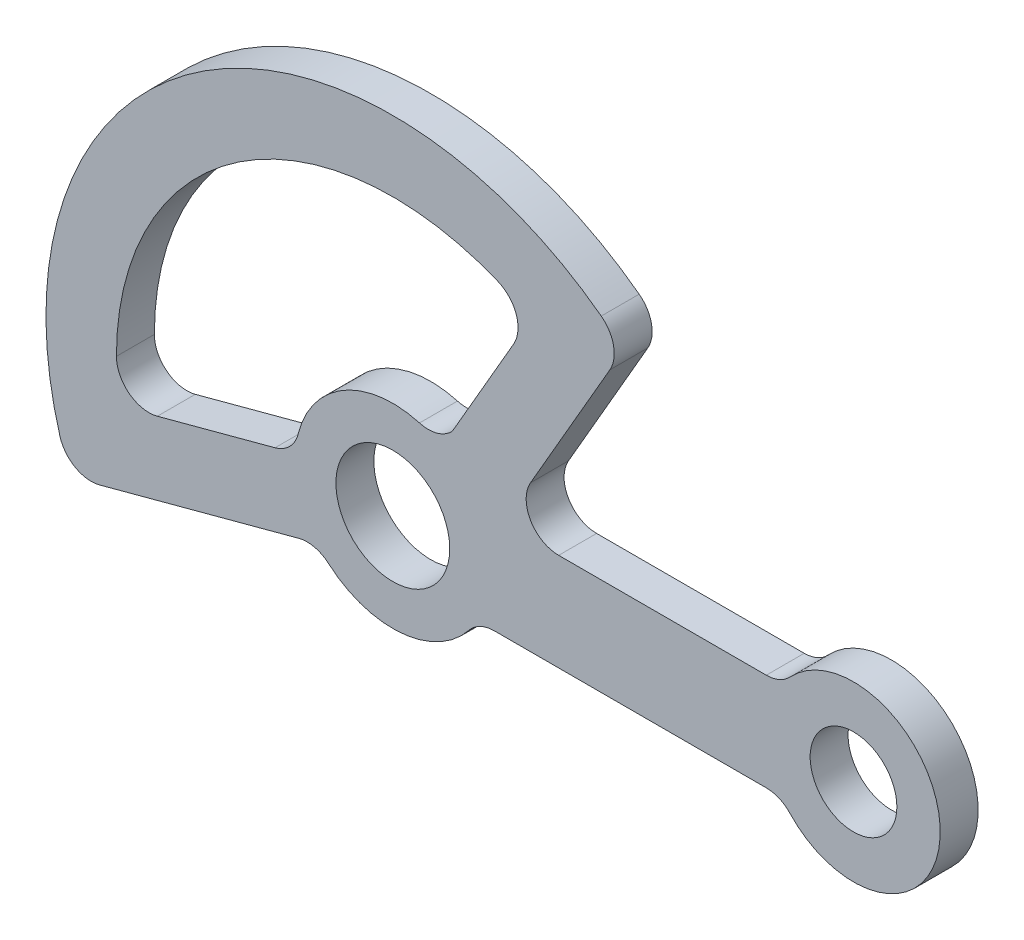
ISO-10303-21;
HEADER;
FILE_DESCRIPTION(('STEP AP214'),'2;1');
FILE_NAME('part.step','',(''),(''),'','','');
FILE_SCHEMA(('AUTOMOTIVE_DESIGN { 1 0 10303 214 1 1 1 1 }'));
ENDSEC;
DATA;
#1=APPLICATION_CONTEXT('core data for automotive mechanical design processes');
#2=APPLICATION_PROTOCOL_DEFINITION('international standard','automotive_design',2000,#1);
#3=PRODUCT_CONTEXT('',#1,'mechanical');
#4=PRODUCT('Part','Part','',(#3));
#5=PRODUCT_RELATED_PRODUCT_CATEGORY('part','',(#4));
#6=PRODUCT_DEFINITION_FORMATION('','',#4);
#7=PRODUCT_DEFINITION_CONTEXT('part definition',#1,'design');
#8=PRODUCT_DEFINITION('design','',#6,#7);
#9=PRODUCT_DEFINITION_SHAPE('','',#8);
#10=(LENGTH_UNIT() NAMED_UNIT(*) SI_UNIT(.MILLI.,.METRE.));
#11=(NAMED_UNIT(*) PLANE_ANGLE_UNIT() SI_UNIT($,.RADIAN.));
#12=(NAMED_UNIT(*) SI_UNIT($,.STERADIAN.) SOLID_ANGLE_UNIT());
#13=UNCERTAINTY_MEASURE_WITH_UNIT(LENGTH_MEASURE(1.E-05),#10,'distance_accuracy_value','');
#14=(GEOMETRIC_REPRESENTATION_CONTEXT(3) GLOBAL_UNCERTAINTY_ASSIGNED_CONTEXT((#13)) GLOBAL_UNIT_ASSIGNED_CONTEXT((#10,
#11,#12)) REPRESENTATION_CONTEXT('',''));
#15=CARTESIAN_POINT('',(0.,0.,0.));
#16=DIRECTION('',(0.,0.,1.));
#17=DIRECTION('',(1.,0.,0.));
#18=AXIS2_PLACEMENT_3D('',#15,#16,#17);
#19=CARTESIAN_POINT('',(6.56363872774086,23.0850307916559,7.));
#20=DIRECTION('',(0.,0.,-1.));
#21=DIRECTION('',(-1.,0.,0.));
#22=AXIS2_PLACEMENT_3D('',#19,#20,#21);
#23=CYLINDRICAL_SURFACE('',#22,6.);
#24=CARTESIAN_POINT('',(6.56363872774086,23.0850307916559,0.));
#25=DIRECTION('',(0.,0.,1.));
#26=DIRECTION('',(1.,0.,0.));
#27=AXIS2_PLACEMENT_3D('',#24,#25,#26);
#28=CIRCLE('',#27,6.);
#29=CARTESIAN_POINT('',(10.9887440595101,19.0330630224421,0.));
#30=VERTEX_POINT('',#29);
#31=CARTESIAN_POINT('',(4.92272904580564,17.3137730937419,0.));
#32=VERTEX_POINT('',#31);
#33=EDGE_CURVE('E270',#30,#32,#28,.F.);
#34=ORIENTED_EDGE('',*,*,#33,.T.);
#35=DIRECTION('',(0.,0.,-1.));
#36=VECTOR('',#35,1.);
#37=CARTESIAN_POINT('',(4.92272904580564,17.3137730937419,7.));
#38=LINE('',#37,#36);
#39=CARTESIAN_POINT('',(4.92272904580564,17.3137730937419,7.));
#40=VERTEX_POINT('',#39);
#41=EDGE_CURVE('E11',#40,#32,#38,.T.);
#42=ORIENTED_EDGE('',*,*,#41,.F.);
#43=CARTESIAN_POINT('',(6.56363872774086,23.0850307916559,7.));
#44=DIRECTION('',(0.,0.,1.));
#45=DIRECTION('',(1.,0.,0.));
#46=AXIS2_PLACEMENT_3D('',#43,#44,#45);
#47=CIRCLE('',#46,6.);
#48=CARTESIAN_POINT('',(10.9887440595101,19.0330630224421,7.));
#49=VERTEX_POINT('',#48);
#50=EDGE_CURVE('E430',#49,#40,#47,.F.);
#51=ORIENTED_EDGE('',*,*,#50,.F.);
#52=DIRECTION('',(0.,0.,-1.));
#53=VECTOR('',#52,1.);
#54=CARTESIAN_POINT('',(10.9887440595101,19.0330630224421,7.));
#55=LINE('',#54,#53);
#56=EDGE_CURVE('E58',#49,#30,#55,.T.);
#57=ORIENTED_EDGE('',*,*,#56,.T.);
#58=EDGE_LOOP('',(#34,#42,#51,#57));
#59=FACE_BOUND('',#58,.T.);
#60=ADVANCED_FACE('F41',(#59),#23,.F.);
#61=CARTESIAN_POINT('',(0.,0.,7.));
#62=DIRECTION('',(0.,0.,-1.));
#63=DIRECTION('',(-1.,0.,0.));
#64=AXIS2_PLACEMENT_3D('',#61,#62,#63);
#65=CYLINDRICAL_SURFACE('',#64,18.);
#66=CARTESIAN_POINT('',(0.,0.,0.));
#67=DIRECTION('',(0.,0.,1.));
#68=DIRECTION('',(1.,0.,0.));
#69=AXIS2_PLACEMENT_3D('',#66,#67,#68);
#70=CIRCLE('',#69,18.);
#71=CARTESIAN_POINT('',(-17.4629497530065,4.36410196076704,0.));
#72=VERTEX_POINT('',#71);
#73=EDGE_CURVE('E267',#32,#72,#70,.T.);
#74=ORIENTED_EDGE('',*,*,#73,.T.);
#75=DIRECTION('',(0.,0.,-1.));
#76=VECTOR('',#75,1.);
#77=CARTESIAN_POINT('',(-17.4629497530065,4.36410196076704,7.));
#78=LINE('',#77,#76);
#79=CARTESIAN_POINT('',(-17.4629497530065,4.36410196076704,7.));
#80=VERTEX_POINT('',#79);
#81=EDGE_CURVE('E51',#80,#72,#78,.T.);
#82=ORIENTED_EDGE('',*,*,#81,.F.);
#83=CARTESIAN_POINT('',(0.,0.,7.));
#84=DIRECTION('',(0.,0.,1.));
#85=DIRECTION('',(1.,0.,0.));
#86=AXIS2_PLACEMENT_3D('',#83,#84,#85);
#87=CIRCLE('',#86,18.);
#88=EDGE_CURVE('E429',#40,#80,#87,.T.);
#89=ORIENTED_EDGE('',*,*,#88,.F.);
#90=ORIENTED_EDGE('',*,*,#41,.T.);
#91=EDGE_LOOP('',(#74,#82,#89,#90));
#92=FACE_BOUND('',#91,.T.);
#93=ADVANCED_FACE('F452',(#92),#65,.T.);
#94=CARTESIAN_POINT('',(-23.2839330040086,5.81880261435606,7.));
#95=DIRECTION('',(0.,0.,-1.));
#96=DIRECTION('',(-1.,0.,0.));
#97=AXIS2_PLACEMENT_3D('',#94,#95,#96);
#98=CYLINDRICAL_SURFACE('',#97,6.);
#99=CARTESIAN_POINT('',(-23.2839330040086,5.81880261435606,0.));
#100=DIRECTION('',(0.,0.,1.));
#101=DIRECTION('',(1.,0.,0.));
#102=AXIS2_PLACEMENT_3D('',#99,#100,#101);
#103=CIRCLE('',#102,6.);
#104=CARTESIAN_POINT('',(-21.7310187333935,0.0232476566216526,0.));
#105=VERTEX_POINT('',#104);
#106=EDGE_CURVE('E275',#105,#72,#103,.T.);
#107=ORIENTED_EDGE('',*,*,#106,.F.);
#108=DIRECTION('',(0.,0.,-1.));
#109=VECTOR('',#108,1.);
#110=CARTESIAN_POINT('',(-21.7310187333935,0.0232476566216526,7.));
#111=LINE('',#110,#109);
#112=CARTESIAN_POINT('',(-21.7310187333935,0.0232476566216526,7.));
#113=VERTEX_POINT('',#112);
#114=EDGE_CURVE('E291',#113,#105,#111,.T.);
#115=ORIENTED_EDGE('',*,*,#114,.F.);
#116=CARTESIAN_POINT('',(-23.2839330040086,5.81880261435606,7.));
#117=DIRECTION('',(0.,0.,1.));
#118=DIRECTION('',(1.,0.,0.));
#119=AXIS2_PLACEMENT_3D('',#116,#117,#118);
#120=CIRCLE('',#119,6.);
#121=EDGE_CURVE('E432',#113,#80,#120,.T.);
#122=ORIENTED_EDGE('',*,*,#121,.T.);
#123=ORIENTED_EDGE('',*,*,#81,.T.);
#124=EDGE_LOOP('',(#107,#115,#122,#123));
#125=FACE_BOUND('',#124,.T.);
#126=ADVANCED_FACE('F458',(#125),#98,.F.);
#127=CARTESIAN_POINT('',(-1.46151414423502,5.45444504226563,7.));
#128=DIRECTION('',(0.258819045102522,-0.965925826289068,0.));
#129=DIRECTION('',(0.965925826289068,0.258819045102522,0.));
#130=AXIS2_PLACEMENT_3D('',#127,#128,#129);
#131=PLANE('',#130);
#132=DIRECTION('',(-0.965925826289068,-0.258819045102522,0.));
#133=VECTOR('',#132,1.);
#134=CARTESIAN_POINT('',(-1.46151414423502,5.45444504226563,0.));
#135=LINE('',#134,#133);
#136=CARTESIAN_POINT('',(-43.4470857293849,-5.79555495773441,0.));
#137=VERTEX_POINT('',#136);
#138=EDGE_CURVE('E274',#105,#137,#135,.T.);
#139=ORIENTED_EDGE('',*,*,#138,.T.);
#140=DIRECTION('',(0.,0.,-1.));
#141=VECTOR('',#140,1.);
#142=CARTESIAN_POINT('',(-43.4470857293849,-5.79555495773441,7.));
#143=LINE('',#142,#141);
#144=CARTESIAN_POINT('',(-43.4470857293849,-5.79555495773441,7.));
#145=VERTEX_POINT('',#144);
#146=EDGE_CURVE('E292',#145,#137,#143,.T.);
#147=ORIENTED_EDGE('',*,*,#146,.F.);
#148=DIRECTION('',(-0.965925826289068,-0.258819045102522,0.));
#149=VECTOR('',#148,1.);
#150=CARTESIAN_POINT('',(-1.46151414423502,5.45444504226563,7.));
#151=LINE('',#150,#149);
#152=EDGE_CURVE('E434',#113,#145,#151,.T.);
#153=ORIENTED_EDGE('',*,*,#152,.F.);
#154=ORIENTED_EDGE('',*,*,#114,.T.);
#155=EDGE_LOOP('',(#139,#147,#153,#154));
#156=FACE_BOUND('',#155,.T.);
#157=ADVANCED_FACE('F509',(#156),#131,.F.);
#158=CARTESIAN_POINT('',(-45.,0.,7.));
#159=DIRECTION('',(0.,0.,-1.));
#160=DIRECTION('',(-1.,0.,0.));
#161=AXIS2_PLACEMENT_3D('',#158,#159,#160);
#162=CYLINDRICAL_SURFACE('',#161,6.);
#163=CARTESIAN_POINT('',(-45.,0.,0.));
#164=DIRECTION('',(0.,0.,1.));
#165=DIRECTION('',(1.,0.,0.));
#166=AXIS2_PLACEMENT_3D('',#163,#164,#165);
#167=CIRCLE('',#166,6.);
#168=CARTESIAN_POINT('',(-51.,0.,0.));
#169=VERTEX_POINT('',#168);
#170=EDGE_CURVE('E277',#169,#137,#167,.T.);
#171=ORIENTED_EDGE('',*,*,#170,.F.);
#172=DIRECTION('',(0.,0.,-1.));
#173=VECTOR('',#172,1.);
#174=CARTESIAN_POINT('',(-51.,0.,7.));
#175=LINE('',#174,#173);
#176=CARTESIAN_POINT('',(-51.,0.,7.));
#177=VERTEX_POINT('',#176);
#178=EDGE_CURVE('E210',#177,#169,#175,.T.);
#179=ORIENTED_EDGE('',*,*,#178,.F.);
#180=CARTESIAN_POINT('',(-45.,0.,7.));
#181=DIRECTION('',(0.,0.,1.));
#182=DIRECTION('',(1.,0.,0.));
#183=AXIS2_PLACEMENT_3D('',#180,#181,#182);
#184=CIRCLE('',#183,6.);
#185=EDGE_CURVE('E220',#177,#145,#184,.T.);
#186=ORIENTED_EDGE('',*,*,#185,.T.);
#187=ORIENTED_EDGE('',*,*,#146,.T.);
#188=EDGE_LOOP('',(#171,#179,#186,#187));
#189=FACE_BOUND('',#188,.T.);
#190=ADVANCED_FACE('F437',(#189),#162,.F.);
#191=CARTESIAN_POINT('',(0.,0.,7.));
#192=DIRECTION('',(0.,0.,-1.));
#193=DIRECTION('',(-1.,0.,0.));
#194=AXIS2_PLACEMENT_3D('',#191,#192,#193);
#195=CYLINDRICAL_SURFACE('',#194,51.);
#196=CARTESIAN_POINT('',(0.,0.,0.));
#197=DIRECTION('',(0.,0.,1.));
#198=DIRECTION('',(1.,0.,0.));
#199=AXIS2_PLACEMENT_3D('',#196,#197,#198);
#200=CIRCLE('',#199,51.);
#201=CARTESIAN_POINT('',(19.3833441247073,47.1729368445847,0.));
#202=VERTEX_POINT('',#201);
#203=EDGE_CURVE('E201',#202,#169,#200,.T.);
#204=ORIENTED_EDGE('',*,*,#203,.F.);
#205=DIRECTION('',(0.,0.,-1.));
#206=VECTOR('',#205,1.);
#207=CARTESIAN_POINT('',(19.3833441247073,47.1729368445847,7.));
#208=LINE('',#207,#206);
#209=CARTESIAN_POINT('',(19.3833441247073,47.1729368445847,7.));
#210=VERTEX_POINT('',#209);
#211=EDGE_CURVE('E198',#210,#202,#208,.T.);
#212=ORIENTED_EDGE('',*,*,#211,.F.);
#213=CARTESIAN_POINT('',(0.,0.,7.));
#214=DIRECTION('',(0.,0.,1.));
#215=DIRECTION('',(1.,0.,0.));
#216=AXIS2_PLACEMENT_3D('',#213,#214,#215);
#217=CIRCLE('',#216,51.);
#218=EDGE_CURVE('E202',#210,#177,#217,.T.);
#219=ORIENTED_EDGE('',*,*,#218,.T.);
#220=ORIENTED_EDGE('',*,*,#178,.T.);
#221=EDGE_LOOP('',(#204,#212,#219,#220));
#222=FACE_BOUND('',#221,.T.);
#223=ADVANCED_FACE('F196',(#222),#195,.F.);
#224=CARTESIAN_POINT('',(17.1029506982712,41.6231795687512,7.));
#225=DIRECTION('',(0.,0.,-1.));
#226=DIRECTION('',(-1.,0.,0.));
#227=AXIS2_PLACEMENT_3D('',#224,#225,#226);
#228=CYLINDRICAL_SURFACE('',#227,6.);
#229=CARTESIAN_POINT('',(17.1029506982712,41.6231795687512,0.));
#230=DIRECTION('',(0.,0.,1.));
#231=DIRECTION('',(1.,0.,0.));
#232=AXIS2_PLACEMENT_3D('',#229,#230,#231);
#233=CIRCLE('',#232,6.);
#234=CARTESIAN_POINT('',(22.2991031209778,38.6231795687512,0.));
#235=VERTEX_POINT('',#234);
#236=EDGE_CURVE('E285',#235,#202,#233,.T.);
#237=ORIENTED_EDGE('',*,*,#236,.F.);
#238=DIRECTION('',(0.,0.,-1.));
#239=VECTOR('',#238,1.);
#240=CARTESIAN_POINT('',(22.2991031209778,38.6231795687512,7.));
#241=LINE('',#240,#239);
#242=CARTESIAN_POINT('',(22.2991031209778,38.6231795687512,7.));
#243=VERTEX_POINT('',#242);
#244=EDGE_CURVE('E126',#243,#235,#241,.T.);
#245=ORIENTED_EDGE('',*,*,#244,.F.);
#246=CARTESIAN_POINT('',(17.1029506982712,41.6231795687512,7.));
#247=DIRECTION('',(0.,0.,1.));
#248=DIRECTION('',(1.,0.,0.));
#249=AXIS2_PLACEMENT_3D('',#246,#247,#248);
#250=CIRCLE('',#249,6.);
#251=EDGE_CURVE('E214',#243,#210,#250,.T.);
#252=ORIENTED_EDGE('',*,*,#251,.T.);
#253=ORIENTED_EDGE('',*,*,#211,.T.);
#254=EDGE_LOOP('',(#237,#245,#252,#253));
#255=FACE_BOUND('',#254,.T.);
#256=ADVANCED_FACE('F219',(#255),#228,.F.);
#257=CARTESIAN_POINT('',(18.7349939951952,-15.,7.));
#258=DIRECTION('',(0.,0.,-1.));
#259=DIRECTION('',(-1.,0.,0.));
#260=AXIS2_PLACEMENT_3D('',#257,#258,#259);
#261=CYLINDRICAL_SURFACE('',#260,6.);
#262=CARTESIAN_POINT('',(18.7349939951952,-15.,0.));
#263=DIRECTION('',(0.,0.,1.));
#264=DIRECTION('',(1.,0.,0.));
#265=AXIS2_PLACEMENT_3D('',#262,#263,#264);
#266=CIRCLE('',#265,6.);
#267=CARTESIAN_POINT('',(18.7349939951952,-9.,0.));
#268=VERTEX_POINT('',#267);
#269=CARTESIAN_POINT('',(14.0512454963964,-11.25,0.));
#270=VERTEX_POINT('',#269);
#271=EDGE_CURVE('E226',#268,#270,#266,.T.);
#272=ORIENTED_EDGE('',*,*,#271,.F.);
#273=DIRECTION('',(0.,0.,-1.));
#274=VECTOR('',#273,1.);
#275=CARTESIAN_POINT('',(18.7349939951952,-9.,7.));
#276=LINE('',#275,#274);
#277=CARTESIAN_POINT('',(18.7349939951952,-9.,7.));
#278=VERTEX_POINT('',#277);
#279=EDGE_CURVE('E44',#278,#268,#276,.T.);
#280=ORIENTED_EDGE('',*,*,#279,.F.);
#281=CARTESIAN_POINT('',(18.7349939951952,-15.,7.));
#282=DIRECTION('',(0.,0.,1.));
#283=DIRECTION('',(1.,0.,0.));
#284=AXIS2_PLACEMENT_3D('',#281,#282,#283);
#285=CIRCLE('',#284,6.);
#286=CARTESIAN_POINT('',(14.0512454963964,-11.25,7.));
#287=VERTEX_POINT('',#286);
#288=EDGE_CURVE('E290',#278,#287,#285,.T.);
#289=ORIENTED_EDGE('',*,*,#288,.T.);
#290=DIRECTION('',(0.,0.,-1.));
#291=VECTOR('',#290,1.);
#292=CARTESIAN_POINT('',(14.0512454963964,-11.25,7.));
#293=LINE('',#292,#291);
#294=EDGE_CURVE('E225',#287,#270,#293,.T.);
#295=ORIENTED_EDGE('',*,*,#294,.T.);
#296=EDGE_LOOP('',(#272,#280,#289,#295));
#297=FACE_BOUND('',#296,.T.);
#298=ADVANCED_FACE('F43',(#297),#261,.F.);
#299=CARTESIAN_POINT('',(0.,-9.,7.));
#300=DIRECTION('',(0.,1.,0.));
#301=DIRECTION('',(-1.,0.,0.));
#302=AXIS2_PLACEMENT_3D('',#299,#300,#301);
#303=PLANE('',#302);
#304=DIRECTION('',(1.,0.,0.));
#305=VECTOR('',#304,1.);
#306=CARTESIAN_POINT('',(0.,-9.,0.));
#307=LINE('',#306,#305);
#308=CARTESIAN_POINT('',(68.9065230605689,-9.,0.));
#309=VERTEX_POINT('',#308);
#310=EDGE_CURVE('E227',#268,#309,#307,.T.);
#311=ORIENTED_EDGE('',*,*,#310,.T.);
#312=DIRECTION('',(0.,0.,-1.));
#313=VECTOR('',#312,1.);
#314=CARTESIAN_POINT('',(68.9065230605689,-9.,7.));
#315=LINE('',#314,#313);
#316=CARTESIAN_POINT('',(68.9065230605689,-9.,7.));
#317=VERTEX_POINT('',#316);
#318=EDGE_CURVE('E323',#317,#309,#315,.T.);
#319=ORIENTED_EDGE('',*,*,#318,.F.);
#320=DIRECTION('',(1.,0.,0.));
#321=VECTOR('',#320,1.);
#322=CARTESIAN_POINT('',(0.,-9.,7.));
#323=LINE('',#322,#321);
#324=EDGE_CURVE('E333',#278,#317,#323,.T.);
#325=ORIENTED_EDGE('',*,*,#324,.F.);
#326=ORIENTED_EDGE('',*,*,#279,.T.);
#327=EDGE_LOOP('',(#311,#319,#325,#326));
#328=FACE_BOUND('',#327,.T.);
#329=ADVANCED_FACE('F335',(#328),#303,.F.);
#330=CARTESIAN_POINT('',(68.9065230605689,-15.,7.));
#331=DIRECTION('',(0.,0.,-1.));
#332=DIRECTION('',(-1.,0.,0.));
#333=AXIS2_PLACEMENT_3D('',#330,#331,#332);
#334=CYLINDRICAL_SURFACE('',#333,6.00000000000001);
#335=CARTESIAN_POINT('',(68.9065230605689,-15.,0.));
#336=DIRECTION('',(0.,0.,1.));
#337=DIRECTION('',(1.,0.,0.));
#338=AXIS2_PLACEMENT_3D('',#335,#336,#337);
#339=CIRCLE('',#338,6.00000000000001);
#340=CARTESIAN_POINT('',(73.2956531349592,-10.9090909090909,0.));
#341=VERTEX_POINT('',#340);
#342=EDGE_CURVE('E231',#309,#341,#339,.F.);
#343=ORIENTED_EDGE('',*,*,#342,.T.);
#344=DIRECTION('',(0.,0.,-1.));
#345=VECTOR('',#344,1.);
#346=CARTESIAN_POINT('',(73.2956531349592,-10.9090909090909,7.));
#347=LINE('',#346,#345);
#348=CARTESIAN_POINT('',(73.2956531349592,-10.9090909090909,7.));
#349=VERTEX_POINT('',#348);
#350=EDGE_CURVE('E325',#349,#341,#347,.T.);
#351=ORIENTED_EDGE('',*,*,#350,.F.);
#352=CARTESIAN_POINT('',(68.9065230605689,-15.,7.));
#353=DIRECTION('',(0.,0.,1.));
#354=DIRECTION('',(1.,0.,0.));
#355=AXIS2_PLACEMENT_3D('',#352,#353,#354);
#356=CIRCLE('',#355,6.00000000000001);
#357=EDGE_CURVE('E399',#317,#349,#356,.F.);
#358=ORIENTED_EDGE('',*,*,#357,.F.);
#359=ORIENTED_EDGE('',*,*,#318,.T.);
#360=EDGE_LOOP('',(#343,#351,#358,#359));
#361=FACE_BOUND('',#360,.T.);
#362=ADVANCED_FACE('F396',(#361),#334,.F.);
#363=CARTESIAN_POINT('',(85.,0.,7.));
#364=DIRECTION('',(0.,0.,-1.));
#365=DIRECTION('',(-1.,0.,0.));
#366=AXIS2_PLACEMENT_3D('',#363,#364,#365);
#367=CYLINDRICAL_SURFACE('',#366,16.);
#368=CARTESIAN_POINT('',(85.,0.,0.));
#369=DIRECTION('',(0.,0.,1.));
#370=DIRECTION('',(1.,0.,0.));
#371=AXIS2_PLACEMENT_3D('',#368,#369,#370);
#372=CIRCLE('',#371,16.);
#373=CARTESIAN_POINT('',(73.2956531349592,10.9090909090909,0.));
#374=VERTEX_POINT('',#373);
#375=EDGE_CURVE('E232',#341,#374,#372,.T.);
#376=ORIENTED_EDGE('',*,*,#375,.T.);
#377=DIRECTION('',(0.,0.,-1.));
#378=VECTOR('',#377,1.);
#379=CARTESIAN_POINT('',(73.2956531349592,10.9090909090909,7.));
#380=LINE('',#379,#378);
#381=CARTESIAN_POINT('',(73.2956531349592,10.9090909090909,7.));
#382=VERTEX_POINT('',#381);
#383=EDGE_CURVE('E319',#382,#374,#380,.T.);
#384=ORIENTED_EDGE('',*,*,#383,.F.);
#385=CARTESIAN_POINT('',(85.,0.,7.));
#386=DIRECTION('',(0.,0.,1.));
#387=DIRECTION('',(1.,0.,0.));
#388=AXIS2_PLACEMENT_3D('',#385,#386,#387);
#389=CIRCLE('',#388,16.);
#390=EDGE_CURVE('E400',#349,#382,#389,.T.);
#391=ORIENTED_EDGE('',*,*,#390,.F.);
#392=ORIENTED_EDGE('',*,*,#350,.T.);
#393=EDGE_LOOP('',(#376,#384,#391,#392));
#394=FACE_BOUND('',#393,.T.);
#395=ADVANCED_FACE('F395',(#394),#367,.T.);
#396=CARTESIAN_POINT('',(68.9065230605689,15.,7.));
#397=DIRECTION('',(0.,0.,-1.));
#398=DIRECTION('',(-1.,0.,0.));
#399=AXIS2_PLACEMENT_3D('',#396,#397,#398);
#400=CYLINDRICAL_SURFACE('',#399,6.00000000000001);
#401=CARTESIAN_POINT('',(68.9065230605689,15.,0.));
#402=DIRECTION('',(0.,0.,1.));
#403=DIRECTION('',(1.,0.,0.));
#404=AXIS2_PLACEMENT_3D('',#401,#402,#403);
#405=CIRCLE('',#404,6.00000000000001);
#406=CARTESIAN_POINT('',(68.9065230605689,9.,0.));
#407=VERTEX_POINT('',#406);
#408=EDGE_CURVE('E237',#407,#374,#405,.T.);
#409=ORIENTED_EDGE('',*,*,#408,.F.);
#410=DIRECTION('',(0.,0.,-1.));
#411=VECTOR('',#410,1.);
#412=CARTESIAN_POINT('',(68.9065230605689,9.,7.));
#413=LINE('',#412,#411);
#414=CARTESIAN_POINT('',(68.9065230605689,9.,7.));
#415=VERTEX_POINT('',#414);
#416=EDGE_CURVE('E318',#415,#407,#413,.T.);
#417=ORIENTED_EDGE('',*,*,#416,.F.);
#418=CARTESIAN_POINT('',(68.9065230605689,15.,7.));
#419=DIRECTION('',(0.,0.,1.));
#420=DIRECTION('',(1.,0.,0.));
#421=AXIS2_PLACEMENT_3D('',#418,#419,#420);
#422=CIRCLE('',#421,6.00000000000001);
#423=EDGE_CURVE('E405',#415,#382,#422,.T.);
#424=ORIENTED_EDGE('',*,*,#423,.T.);
#425=ORIENTED_EDGE('',*,*,#383,.T.);
#426=EDGE_LOOP('',(#409,#417,#424,#425));
#427=FACE_BOUND('',#426,.T.);
#428=ADVANCED_FACE('F393',(#427),#400,.F.);
#429=CARTESIAN_POINT('',(0.,9.,7.));
#430=DIRECTION('',(0.,1.,0.));
#431=DIRECTION('',(0.,0.,1.));
#432=AXIS2_PLACEMENT_3D('',#429,#430,#431);
#433=PLANE('',#432);
#434=DIRECTION('',(1.,0.,0.));
#435=VECTOR('',#434,1.);
#436=CARTESIAN_POINT('',(0.,9.,0.));
#437=LINE('',#436,#435);
#438=CARTESIAN_POINT('',(30.5995642670503,9.,0.));
#439=VERTEX_POINT('',#438);
#440=EDGE_CURVE('E236',#439,#407,#437,.T.);
#441=ORIENTED_EDGE('',*,*,#440,.F.);
#442=DIRECTION('',(0.,0.,-1.));
#443=VECTOR('',#442,1.);
#444=CARTESIAN_POINT('',(30.5995642670503,9.,7.));
#445=LINE('',#444,#443);
#446=CARTESIAN_POINT('',(30.5995642670503,9.,7.));
#447=VERTEX_POINT('',#446);
#448=EDGE_CURVE('E316',#447,#439,#445,.T.);
#449=ORIENTED_EDGE('',*,*,#448,.F.);
#450=DIRECTION('',(1.,0.,0.));
#451=VECTOR('',#450,1.);
#452=CARTESIAN_POINT('',(0.,9.,7.));
#453=LINE('',#452,#451);
#454=EDGE_CURVE('E390',#447,#415,#453,.T.);
#455=ORIENTED_EDGE('',*,*,#454,.T.);
#456=ORIENTED_EDGE('',*,*,#416,.T.);
#457=EDGE_LOOP('',(#441,#449,#455,#456));
#458=FACE_BOUND('',#457,.T.);
#459=ADVANCED_FACE('F385',(#458),#433,.T.);
#460=CARTESIAN_POINT('',(30.5995642670502,15.,7.));
#461=DIRECTION('',(0.,0.,-1.));
#462=DIRECTION('',(-1.,0.,0.));
#463=AXIS2_PLACEMENT_3D('',#460,#461,#462);
#464=CYLINDRICAL_SURFACE('',#463,6.);
#465=CARTESIAN_POINT('',(30.5995642670502,15.,0.));
#466=DIRECTION('',(0.,0.,1.));
#467=DIRECTION('',(1.,0.,0.));
#468=AXIS2_PLACEMENT_3D('',#465,#466,#467);
#469=CIRCLE('',#468,6.);
#470=CARTESIAN_POINT('',(25.4034118443436,18.0000000000001,0.));
#471=VERTEX_POINT('',#470);
#472=EDGE_CURVE('E245',#439,#471,#469,.F.);
#473=ORIENTED_EDGE('',*,*,#472,.T.);
#474=DIRECTION('',(0.,0.,-1.));
#475=VECTOR('',#474,1.);
#476=CARTESIAN_POINT('',(25.4034118443436,18.0000000000001,7.));
#477=LINE('',#476,#475);
#478=CARTESIAN_POINT('',(25.4034118443436,18.0000000000001,7.));
#479=VERTEX_POINT('',#478);
#480=EDGE_CURVE('E313',#479,#471,#477,.T.);
#481=ORIENTED_EDGE('',*,*,#480,.F.);
#482=CARTESIAN_POINT('',(30.5995642670502,15.,7.));
#483=DIRECTION('',(0.,0.,1.));
#484=DIRECTION('',(1.,0.,0.));
#485=AXIS2_PLACEMENT_3D('',#482,#483,#484);
#486=CIRCLE('',#485,6.);
#487=EDGE_CURVE('E407',#447,#479,#486,.F.);
#488=ORIENTED_EDGE('',*,*,#487,.F.);
#489=ORIENTED_EDGE('',*,*,#448,.T.);
#490=EDGE_LOOP('',(#473,#481,#488,#489));
#491=FACE_BOUND('',#490,.T.);
#492=ADVANCED_FACE('F485',(#491),#464,.F.);
#493=CARTESIAN_POINT('',(11.2583302491977,-6.50000000000001,7.));
#494=DIRECTION('',(-0.866025403784438,0.500000000000001,0.));
#495=DIRECTION('',(-0.500000000000001,-0.866025403784438,0.));
#496=AXIS2_PLACEMENT_3D('',#493,#494,#495);
#497=PLANE('',#496);
#498=DIRECTION('',(0.500000000000001,0.866025403784438,0.));
#499=VECTOR('',#498,1.);
#500=CARTESIAN_POINT('',(11.2583302491977,-6.50000000000001,0.));
#501=LINE('',#500,#499);
#502=CARTESIAN_POINT('',(40.0463485901673,43.3623104157839,0.));
#503=VERTEX_POINT('',#502);
#504=EDGE_CURVE('E244',#471,#503,#501,.T.);
#505=ORIENTED_EDGE('',*,*,#504,.T.);
#506=DIRECTION('',(0.,0.,-1.));
#507=VECTOR('',#506,1.);
#508=CARTESIAN_POINT('',(40.0463485901673,43.3623104157839,7.));
#509=LINE('',#508,#507);
#510=CARTESIAN_POINT('',(40.0463485901673,43.3623104157839,7.));
#511=VERTEX_POINT('',#510);
#512=EDGE_CURVE('E307',#511,#503,#509,.T.);
#513=ORIENTED_EDGE('',*,*,#512,.F.);
#514=DIRECTION('',(0.500000000000001,0.866025403784438,0.));
#515=VECTOR('',#514,1.);
#516=CARTESIAN_POINT('',(11.2583302491977,-6.50000000000001,7.));
#517=LINE('',#516,#515);
#518=EDGE_CURVE('E377',#479,#511,#517,.T.);
#519=ORIENTED_EDGE('',*,*,#518,.F.);
#520=ORIENTED_EDGE('',*,*,#480,.T.);
#521=EDGE_LOOP('',(#505,#513,#519,#520));
#522=FACE_BOUND('',#521,.T.);
#523=ADVANCED_FACE('F373',(#522),#497,.F.);
#524=CARTESIAN_POINT('',(34.8501961674607,46.3623104157839,7.));
#525=DIRECTION('',(0.,0.,-1.));
#526=DIRECTION('',(-1.,0.,0.));
#527=AXIS2_PLACEMENT_3D('',#524,#525,#526);
#528=CYLINDRICAL_SURFACE('',#527,5.99999999999999);
#529=CARTESIAN_POINT('',(34.8501961674607,46.3623104157839,0.));
#530=DIRECTION('',(0.,0.,1.));
#531=DIRECTION('',(1.,0.,0.));
#532=AXIS2_PLACEMENT_3D('',#529,#530,#531);
#533=CIRCLE('',#532,5.99999999999999);
#534=CARTESIAN_POINT('',(38.4553888744394,51.1584114932788,0.));
#535=VERTEX_POINT('',#534);
#536=EDGE_CURVE('E247',#503,#535,#533,.T.);
#537=ORIENTED_EDGE('',*,*,#536,.T.);
#538=DIRECTION('',(0.,0.,-1.));
#539=VECTOR('',#538,1.);
#540=CARTESIAN_POINT('',(38.4553888744394,51.1584114932788,7.));
#541=LINE('',#540,#539);
#542=CARTESIAN_POINT('',(38.4553888744394,51.1584114932788,7.));
#543=VERTEX_POINT('',#542);
#544=EDGE_CURVE('E310',#543,#535,#541,.T.);
#545=ORIENTED_EDGE('',*,*,#544,.F.);
#546=CARTESIAN_POINT('',(34.8501961674607,46.3623104157839,7.));
#547=DIRECTION('',(0.,0.,1.));
#548=DIRECTION('',(1.,0.,0.));
#549=AXIS2_PLACEMENT_3D('',#546,#547,#548);
#550=CIRCLE('',#549,5.99999999999999);
#551=EDGE_CURVE('E372',#511,#543,#550,.T.);
#552=ORIENTED_EDGE('',*,*,#551,.F.);
#553=ORIENTED_EDGE('',*,*,#512,.T.);
#554=EDGE_LOOP('',(#537,#545,#552,#553));
#555=FACE_BOUND('',#554,.T.);
#556=ADVANCED_FACE('F369',(#555),#528,.T.);
#557=CARTESIAN_POINT('',(0.,0.,7.));
#558=DIRECTION('',(0.,0.,-1.));
#559=DIRECTION('',(-1.,0.,0.));
#560=AXIS2_PLACEMENT_3D('',#557,#558,#559);
#561=CYLINDRICAL_SURFACE('',#560,64.);
#562=CARTESIAN_POINT('',(0.,0.,0.));
#563=DIRECTION('',(0.,0.,1.));
#564=DIRECTION('',(1.,0.,0.));
#565=AXIS2_PLACEMENT_3D('',#562,#563,#564);
#566=CIRCLE('',#565,64.);
#567=CARTESIAN_POINT('',(-61.4159780112257,-18.002156674261,0.));
#568=VERTEX_POINT('',#567);
#569=EDGE_CURVE('E246',#535,#568,#566,.T.);
#570=ORIENTED_EDGE('',*,*,#569,.T.);
#571=DIRECTION('',(0.,0.,-1.));
#572=VECTOR('',#571,1.);
#573=CARTESIAN_POINT('',(-61.4159780112257,-18.002156674261,7.));
#574=LINE('',#573,#572);
#575=CARTESIAN_POINT('',(-61.4159780112257,-18.002156674261,7.));
#576=VERTEX_POINT('',#575);
#577=EDGE_CURVE('E305',#576,#568,#574,.T.);
#578=ORIENTED_EDGE('',*,*,#577,.F.);
#579=CARTESIAN_POINT('',(0.,0.,7.));
#580=DIRECTION('',(0.,0.,1.));
#581=DIRECTION('',(1.,0.,0.));
#582=AXIS2_PLACEMENT_3D('',#579,#580,#581);
#583=CIRCLE('',#582,64.);
#584=EDGE_CURVE('E370',#543,#576,#583,.T.);
#585=ORIENTED_EDGE('',*,*,#584,.F.);
#586=ORIENTED_EDGE('',*,*,#544,.T.);
#587=EDGE_LOOP('',(#570,#578,#585,#586));
#588=FACE_BOUND('',#587,.T.);
#589=ADVANCED_FACE('F362',(#588),#561,.T.);
#590=CARTESIAN_POINT('',(-55.6582300726733,-16.314454486049,7.));
#591=DIRECTION('',(0.,0.,-1.));
#592=DIRECTION('',(-1.,0.,0.));
#593=AXIS2_PLACEMENT_3D('',#590,#591,#592);
#594=CYLINDRICAL_SURFACE('',#593,6.);
#595=CARTESIAN_POINT('',(-55.6582300726733,-16.314454486049,0.));
#596=DIRECTION('',(0.,0.,1.));
#597=DIRECTION('',(1.,0.,0.));
#598=AXIS2_PLACEMENT_3D('',#595,#596,#597);
#599=CIRCLE('',#598,6.);
#600=CARTESIAN_POINT('',(-54.1053158020582,-22.1100094437834,0.));
#601=VERTEX_POINT('',#600);
#602=EDGE_CURVE('E248',#568,#601,#599,.T.);
#603=ORIENTED_EDGE('',*,*,#602,.T.);
#604=DIRECTION('',(0.,0.,-1.));
#605=VECTOR('',#604,1.);
#606=CARTESIAN_POINT('',(-54.1053158020582,-22.1100094437834,7.));
#607=LINE('',#606,#605);
#608=CARTESIAN_POINT('',(-54.1053158020582,-22.1100094437834,7.));
#609=VERTEX_POINT('',#608);
#610=EDGE_CURVE('E302',#609,#601,#607,.T.);
#611=ORIENTED_EDGE('',*,*,#610,.F.);
#612=CARTESIAN_POINT('',(-55.6582300726733,-16.314454486049,7.));
#613=DIRECTION('',(0.,0.,1.));
#614=DIRECTION('',(1.,0.,0.));
#615=AXIS2_PLACEMENT_3D('',#612,#613,#614);
#616=CIRCLE('',#615,6.);
#617=EDGE_CURVE('E413',#576,#609,#616,.T.);
#618=ORIENTED_EDGE('',*,*,#617,.F.);
#619=ORIENTED_EDGE('',*,*,#577,.T.);
#620=EDGE_LOOP('',(#603,#611,#618,#619));
#621=FACE_BOUND('',#620,.T.);
#622=ADVANCED_FACE('F358',(#621),#594,.T.);
#623=CARTESIAN_POINT('',(1.90313344209776,-7.10259069949226,7.));
#624=DIRECTION('',(0.258819045102522,-0.965925826289068,0.));
#625=DIRECTION('',(0.965925826289068,0.258819045102522,0.));
#626=AXIS2_PLACEMENT_3D('',#623,#624,#625);
#627=PLANE('',#626);
#628=DIRECTION('',(-0.965925826289068,-0.258819045102522,0.));
#629=VECTOR('',#628,1.);
#630=CARTESIAN_POINT('',(1.90313344209776,-7.10259069949226,0.));
#631=LINE('',#630,#629);
#632=CARTESIAN_POINT('',(-17.3596066250599,-12.2640263444978,0.));
#633=VERTEX_POINT('',#632);
#634=EDGE_CURVE('E253',#633,#601,#631,.T.);
#635=ORIENTED_EDGE('',*,*,#634,.F.);
#636=DIRECTION('',(0.,0.,-1.));
#637=VECTOR('',#636,1.);
#638=CARTESIAN_POINT('',(-17.3596066250599,-12.2640263444978,7.));
#639=LINE('',#638,#637);
#640=CARTESIAN_POINT('',(-17.3596066250599,-12.2640263444978,7.));
#641=VERTEX_POINT('',#640);
#642=EDGE_CURVE('E296',#641,#633,#639,.T.);
#643=ORIENTED_EDGE('',*,*,#642,.F.);
#644=DIRECTION('',(-0.965925826289068,-0.258819045102522,0.));
#645=VECTOR('',#644,1.);
#646=CARTESIAN_POINT('',(1.90313344209776,-7.10259069949226,7.));
#647=LINE('',#646,#645);
#648=EDGE_CURVE('E352',#641,#609,#647,.T.);
#649=ORIENTED_EDGE('',*,*,#648,.T.);
#650=ORIENTED_EDGE('',*,*,#610,.T.);
#651=EDGE_LOOP('',(#635,#643,#649,#650));
#652=FACE_BOUND('',#651,.T.);
#653=ADVANCED_FACE('F349',(#652),#627,.T.);
#654=CARTESIAN_POINT('',(-15.8066923544448,-18.0595813022322,7.));
#655=DIRECTION('',(0.,0.,-1.));
#656=DIRECTION('',(-1.,0.,0.));
#657=AXIS2_PLACEMENT_3D('',#654,#655,#656);
#658=CYLINDRICAL_SURFACE('',#657,6.);
#659=CARTESIAN_POINT('',(-15.8066923544448,-18.0595813022322,0.));
#660=DIRECTION('',(0.,0.,1.));
#661=DIRECTION('',(1.,0.,0.));
#662=AXIS2_PLACEMENT_3D('',#659,#660,#661);
#663=CIRCLE('',#662,6.);
#664=CARTESIAN_POINT('',(-11.8550192658336,-13.5446859766742,0.));
#665=VERTEX_POINT('',#664);
#666=EDGE_CURVE('E258',#633,#665,#663,.F.);
#667=ORIENTED_EDGE('',*,*,#666,.T.);
#668=DIRECTION('',(0.,0.,-1.));
#669=VECTOR('',#668,1.);
#670=CARTESIAN_POINT('',(-11.8550192658336,-13.5446859766742,7.));
#671=LINE('',#670,#669);
#672=CARTESIAN_POINT('',(-11.8550192658336,-13.5446859766742,7.));
#673=VERTEX_POINT('',#672);
#674=EDGE_CURVE('E300',#673,#665,#671,.T.);
#675=ORIENTED_EDGE('',*,*,#674,.F.);
#676=CARTESIAN_POINT('',(-15.8066923544448,-18.0595813022322,7.));
#677=DIRECTION('',(0.,0.,1.));
#678=DIRECTION('',(1.,0.,0.));
#679=AXIS2_PLACEMENT_3D('',#676,#677,#678);
#680=CIRCLE('',#679,6.);
#681=EDGE_CURVE('E420',#641,#673,#680,.F.);
#682=ORIENTED_EDGE('',*,*,#681,.F.);
#683=ORIENTED_EDGE('',*,*,#642,.T.);
#684=EDGE_LOOP('',(#667,#675,#682,#683));
#685=FACE_BOUND('',#684,.T.);
#686=ADVANCED_FACE('F470',(#685),#658,.F.);
#687=CARTESIAN_POINT('',(0.,0.,7.));
#688=DIRECTION('',(0.,0.,-1.));
#689=DIRECTION('',(-1.,0.,0.));
#690=AXIS2_PLACEMENT_3D('',#687,#688,#689);
#691=CYLINDRICAL_SURFACE('',#690,10.5);
#692=CARTESIAN_POINT('',(0.,0.,7.));
#693=DIRECTION('',(0.,0.,1.));
#694=DIRECTION('',(1.,0.,0.));
#695=AXIS2_PLACEMENT_3D('',#692,#693,#694);
#696=CIRCLE('',#695,10.5);
#697=CARTESIAN_POINT('',(10.5,0.,7.));
#698=VERTEX_POINT('',#697);
#699=EDGE_CURVE('E424',#698,#698,#696,.T.);
#700=ORIENTED_EDGE('',*,*,#699,.T.);
#701=EDGE_LOOP('',(#700));
#702=FACE_BOUND('',#701,.T.);
#703=CARTESIAN_POINT('',(0.,0.,0.));
#704=DIRECTION('',(0.,0.,1.));
#705=DIRECTION('',(1.,0.,0.));
#706=AXIS2_PLACEMENT_3D('',#703,#704,#705);
#707=CIRCLE('',#706,10.5);
#708=CARTESIAN_POINT('',(10.5,0.,0.));
#709=VERTEX_POINT('',#708);
#710=EDGE_CURVE('E264',#709,#709,#707,.T.);
#711=ORIENTED_EDGE('',*,*,#710,.F.);
#712=EDGE_LOOP('',(#711));
#713=FACE_BOUND('',#712,.T.);
#714=ADVANCED_FACE('F461',(#702,#713),#691,.F.);
#715=CARTESIAN_POINT('',(85.,0.,7.));
#716=DIRECTION('',(0.,0.,-1.));
#717=DIRECTION('',(-1.,0.,0.));
#718=AXIS2_PLACEMENT_3D('',#715,#716,#717);
#719=CYLINDRICAL_SURFACE('',#718,8.);
#720=CARTESIAN_POINT('',(85.,0.,7.));
#721=DIRECTION('',(0.,0.,1.));
#722=DIRECTION('',(1.,0.,0.));
#723=AXIS2_PLACEMENT_3D('',#720,#721,#722);
#724=CIRCLE('',#723,8.);
#725=CARTESIAN_POINT('',(93.,0.,7.));
#726=VERTEX_POINT('',#725);
#727=EDGE_CURVE('E422',#726,#726,#724,.T.);
#728=ORIENTED_EDGE('',*,*,#727,.T.);
#729=EDGE_LOOP('',(#728));
#730=FACE_BOUND('',#729,.T.);
#731=CARTESIAN_POINT('',(85.,0.,0.));
#732=DIRECTION('',(0.,0.,1.));
#733=DIRECTION('',(1.,0.,0.));
#734=AXIS2_PLACEMENT_3D('',#731,#732,#733);
#735=CIRCLE('',#734,8.);
#736=CARTESIAN_POINT('',(93.,0.,0.));
#737=VERTEX_POINT('',#736);
#738=EDGE_CURVE('E263',#737,#737,#735,.T.);
#739=ORIENTED_EDGE('',*,*,#738,.F.);
#740=EDGE_LOOP('',(#739));
#741=FACE_BOUND('',#740,.T.);
#742=ADVANCED_FACE('F447',(#730,#741),#719,.F.);
#743=CARTESIAN_POINT('',(0.,0.,7.));
#744=DIRECTION('',(0.,0.,-1.));
#745=DIRECTION('',(-1.,0.,0.));
#746=AXIS2_PLACEMENT_3D('',#743,#744,#745);
#747=CYLINDRICAL_SURFACE('',#746,18.);
#748=CARTESIAN_POINT('',(0.,0.,0.));
#749=DIRECTION('',(0.,0.,1.));
#750=DIRECTION('',(1.,0.,0.));
#751=AXIS2_PLACEMENT_3D('',#748,#749,#750);
#752=CIRCLE('',#751,18.);
#753=EDGE_CURVE('E256',#665,#270,#752,.T.);
#754=ORIENTED_EDGE('',*,*,#753,.T.);
#755=ORIENTED_EDGE('',*,*,#294,.F.);
#756=CARTESIAN_POINT('',(0.,0.,7.));
#757=DIRECTION('',(0.,0.,1.));
#758=DIRECTION('',(1.,0.,0.));
#759=AXIS2_PLACEMENT_3D('',#756,#757,#758);
#760=CIRCLE('',#759,18.);
#761=EDGE_CURVE('E416',#673,#287,#760,.T.);
#762=ORIENTED_EDGE('',*,*,#761,.F.);
#763=ORIENTED_EDGE('',*,*,#674,.T.);
#764=EDGE_LOOP('',(#754,#755,#762,#763));
#765=FACE_BOUND('',#764,.T.);
#766=ADVANCED_FACE('F343',(#765),#747,.T.);
#767=CARTESIAN_POINT('',(0.,0.,7.));
#768=DIRECTION('',(-0.866025403784438,0.500000000000001,0.));
#769=DIRECTION('',(-0.500000000000001,-0.866025403784438,0.));
#770=AXIS2_PLACEMENT_3D('',#767,#768,#769);
#771=PLANE('',#770);
#772=DIRECTION('',(0.500000000000001,0.866025403784438,0.));
#773=VECTOR('',#772,1.);
#774=CARTESIAN_POINT('',(0.,0.,0.));
#775=LINE('',#774,#773);
#776=EDGE_CURVE('E281',#30,#235,#775,.T.);
#777=ORIENTED_EDGE('',*,*,#776,.F.);
#778=ORIENTED_EDGE('',*,*,#56,.F.);
#779=DIRECTION('',(0.500000000000001,0.866025403784438,0.));
#780=VECTOR('',#779,1.);
#781=CARTESIAN_POINT('',(0.,0.,7.));
#782=LINE('',#781,#780);
#783=EDGE_CURVE('E217',#49,#243,#782,.T.);
#784=ORIENTED_EDGE('',*,*,#783,.T.);
#785=ORIENTED_EDGE('',*,*,#244,.T.);
#786=EDGE_LOOP('',(#777,#778,#784,#785));
#787=FACE_BOUND('',#786,.T.);
#788=ADVANCED_FACE('F443',(#787),#771,.T.);
#789=CARTESIAN_POINT('',(0.,0.,7.));
#790=DIRECTION('',(0.,0.,1.));
#791=DIRECTION('',(1.,0.,0.));
#792=AXIS2_PLACEMENT_3D('',#789,#790,#791);
#793=PLANE('',#792);
#794=ORIENTED_EDGE('',*,*,#288,.F.);
#795=ORIENTED_EDGE('',*,*,#324,.T.);
#796=ORIENTED_EDGE('',*,*,#357,.T.);
#797=ORIENTED_EDGE('',*,*,#390,.T.);
#798=ORIENTED_EDGE('',*,*,#423,.F.);
#799=ORIENTED_EDGE('',*,*,#454,.F.);
#800=ORIENTED_EDGE('',*,*,#487,.T.);
#801=ORIENTED_EDGE('',*,*,#518,.T.);
#802=ORIENTED_EDGE('',*,*,#551,.T.);
#803=ORIENTED_EDGE('',*,*,#584,.T.);
#804=ORIENTED_EDGE('',*,*,#617,.T.);
#805=ORIENTED_EDGE('',*,*,#648,.F.);
#806=ORIENTED_EDGE('',*,*,#681,.T.);
#807=ORIENTED_EDGE('',*,*,#761,.T.);
#808=EDGE_LOOP('',(#794,#795,#796,#797,#798,#799,#800,#801,#802,#803,#804,#805,#806,#807));
#809=FACE_BOUND('',#808,.T.);
#810=ORIENTED_EDGE('',*,*,#727,.F.);
#811=EDGE_LOOP('',(#810));
#812=FACE_BOUND('',#811,.T.);
#813=ORIENTED_EDGE('',*,*,#699,.F.);
#814=EDGE_LOOP('',(#813));
#815=FACE_BOUND('',#814,.T.);
#816=ORIENTED_EDGE('',*,*,#50,.T.);
#817=ORIENTED_EDGE('',*,*,#88,.T.);
#818=ORIENTED_EDGE('',*,*,#121,.F.);
#819=ORIENTED_EDGE('',*,*,#152,.T.);
#820=ORIENTED_EDGE('',*,*,#185,.F.);
#821=ORIENTED_EDGE('',*,*,#218,.F.);
#822=ORIENTED_EDGE('',*,*,#251,.F.);
#823=ORIENTED_EDGE('',*,*,#783,.F.);
#824=EDGE_LOOP('',(#816,#817,#818,#819,#820,#821,#822,#823));
#825=FACE_BOUND('',#824,.T.);
#826=ADVANCED_FACE('F211',(#809,#812,#815,#825),#793,.T.);
#827=CARTESIAN_POINT('',(0.,0.,0.));
#828=DIRECTION('',(0.,0.,1.));
#829=DIRECTION('',(1.,0.,0.));
#830=AXIS2_PLACEMENT_3D('',#827,#828,#829);
#831=PLANE('',#830);
#832=ORIENTED_EDGE('',*,*,#271,.T.);
#833=ORIENTED_EDGE('',*,*,#753,.F.);
#834=ORIENTED_EDGE('',*,*,#666,.F.);
#835=ORIENTED_EDGE('',*,*,#634,.T.);
#836=ORIENTED_EDGE('',*,*,#602,.F.);
#837=ORIENTED_EDGE('',*,*,#569,.F.);
#838=ORIENTED_EDGE('',*,*,#536,.F.);
#839=ORIENTED_EDGE('',*,*,#504,.F.);
#840=ORIENTED_EDGE('',*,*,#472,.F.);
#841=ORIENTED_EDGE('',*,*,#440,.T.);
#842=ORIENTED_EDGE('',*,*,#408,.T.);
#843=ORIENTED_EDGE('',*,*,#375,.F.);
#844=ORIENTED_EDGE('',*,*,#342,.F.);
#845=ORIENTED_EDGE('',*,*,#310,.F.);
#846=EDGE_LOOP('',(#832,#833,#834,#835,#836,#837,#838,#839,#840,#841,#842,#843,#844,#845));
#847=FACE_BOUND('',#846,.T.);
#848=ORIENTED_EDGE('',*,*,#738,.T.);
#849=EDGE_LOOP('',(#848));
#850=FACE_BOUND('',#849,.T.);
#851=ORIENTED_EDGE('',*,*,#710,.T.);
#852=EDGE_LOOP('',(#851));
#853=FACE_BOUND('',#852,.T.);
#854=ORIENTED_EDGE('',*,*,#33,.F.);
#855=ORIENTED_EDGE('',*,*,#776,.T.);
#856=ORIENTED_EDGE('',*,*,#236,.T.);
#857=ORIENTED_EDGE('',*,*,#203,.T.);
#858=ORIENTED_EDGE('',*,*,#170,.T.);
#859=ORIENTED_EDGE('',*,*,#138,.F.);
#860=ORIENTED_EDGE('',*,*,#106,.T.);
#861=ORIENTED_EDGE('',*,*,#73,.F.);
#862=EDGE_LOOP('',(#854,#855,#856,#857,#858,#859,#860,#861));
#863=FACE_BOUND('',#862,.T.);
#864=ADVANCED_FACE('F337',(#847,#850,#853,#863),#831,.F.);
#865=CLOSED_SHELL('',(#60,#93,#126,#157,#190,#223,#256,#298,#329,#362,#395,#428,#459,#492,#523,
#556,#589,#622,#653,#686,#714,#742,#766,#788,#826,#864));
#866=MANIFOLD_SOLID_BREP('B2',#865);
#867=ADVANCED_BREP_SHAPE_REPRESENTATION('',(#18,#866),#14);
#868=SHAPE_DEFINITION_REPRESENTATION(#9,#867);
ENDSEC;
END-ISO-10303-21;
